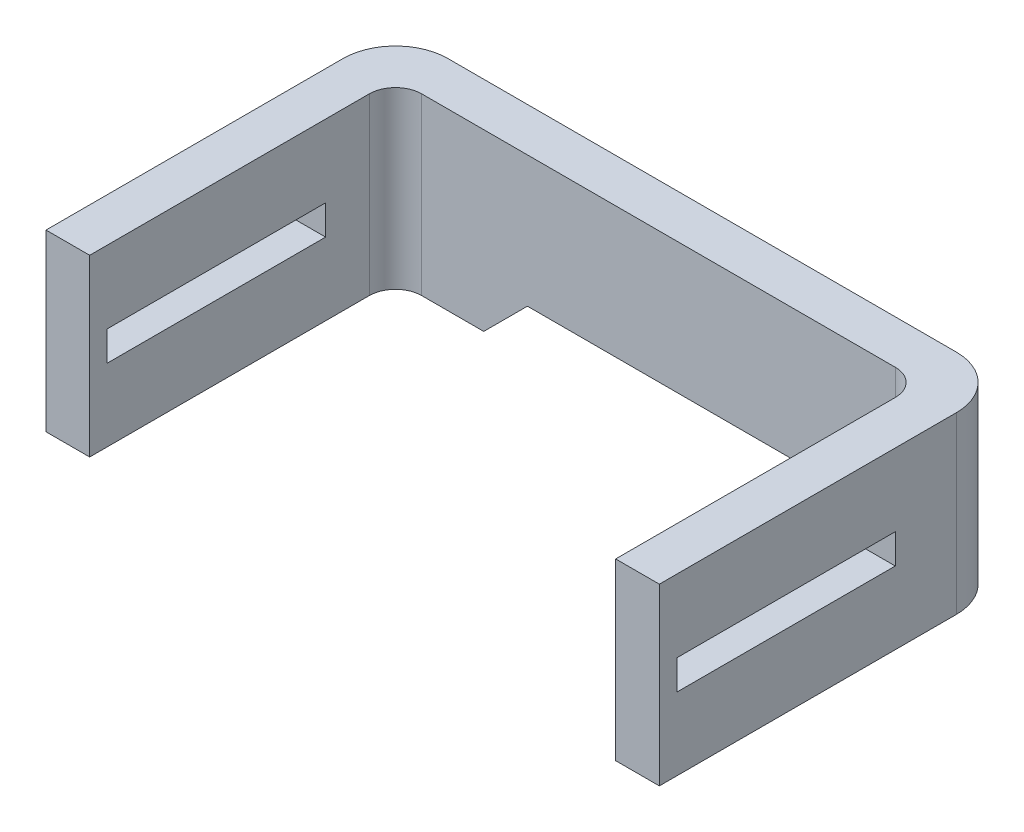
ISO-10303-21;
HEADER;
FILE_DESCRIPTION(('STEP AP214'),'2;1');
FILE_NAME('part.step','',(''),(''),'','','');
FILE_SCHEMA(('AUTOMOTIVE_DESIGN { 1 0 10303 214 1 1 1 1 }'));
ENDSEC;
DATA;
#1=APPLICATION_CONTEXT('core data for automotive mechanical design processes');
#2=APPLICATION_PROTOCOL_DEFINITION('international standard','automotive_design',2000,#1);
#3=PRODUCT_CONTEXT('',#1,'mechanical');
#4=PRODUCT('Part','Part','',(#3));
#5=PRODUCT_RELATED_PRODUCT_CATEGORY('part','',(#4));
#6=PRODUCT_DEFINITION_FORMATION('','',#4);
#7=PRODUCT_DEFINITION_CONTEXT('part definition',#1,'design');
#8=PRODUCT_DEFINITION('design','',#6,#7);
#9=PRODUCT_DEFINITION_SHAPE('','',#8);
#10=(LENGTH_UNIT() NAMED_UNIT(*) SI_UNIT(.MILLI.,.METRE.));
#11=(NAMED_UNIT(*) PLANE_ANGLE_UNIT() SI_UNIT($,.RADIAN.));
#12=(NAMED_UNIT(*) SI_UNIT($,.STERADIAN.) SOLID_ANGLE_UNIT());
#13=UNCERTAINTY_MEASURE_WITH_UNIT(LENGTH_MEASURE(1.E-05),#10,'distance_accuracy_value','');
#14=(GEOMETRIC_REPRESENTATION_CONTEXT(3) GLOBAL_UNCERTAINTY_ASSIGNED_CONTEXT((#13)) GLOBAL_UNIT_ASSIGNED_CONTEXT((#10,
#11,#12)) REPRESENTATION_CONTEXT('',''));
#15=CARTESIAN_POINT('',(0.,0.,0.));
#16=DIRECTION('',(0.,0.,1.));
#17=DIRECTION('',(1.,0.,0.));
#18=AXIS2_PLACEMENT_3D('',#15,#16,#17);
#19=CARTESIAN_POINT('',(0.,0.,0.));
#20=DIRECTION('',(0.,1.,0.));
#21=DIRECTION('',(0.,0.,1.));
#22=AXIS2_PLACEMENT_3D('',#19,#20,#21);
#23=PLANE('',#22);
#24=DIRECTION('',(1.,0.,0.));
#25=VECTOR('',#24,1.);
#26=CARTESIAN_POINT('',(0.,0.,-35.));
#27=LINE('',#26,#25);
#28=CARTESIAN_POINT('',(50.1,0.,-35.));
#29=VERTEX_POINT('',#28);
#30=CARTESIAN_POINT('',(57.2,0.,-35.));
#31=VERTEX_POINT('',#30);
#32=EDGE_CURVE('E217',#29,#31,#27,.T.);
#33=ORIENTED_EDGE('',*,*,#32,.F.);
#34=DIRECTION('',(0.,0.,-1.));
#35=VECTOR('',#34,1.);
#36=CARTESIAN_POINT('',(50.1,0.,0.));
#37=LINE('',#36,#35);
#38=CARTESIAN_POINT('',(50.1,0.,-40.));
#39=VERTEX_POINT('',#38);
#40=EDGE_CURVE('E11',#29,#39,#37,.T.);
#41=ORIENTED_EDGE('',*,*,#40,.T.);
#42=DIRECTION('',(-1.,0.,0.));
#43=VECTOR('',#42,1.);
#44=CARTESIAN_POINT('',(65.2,0.,-40.));
#45=LINE('',#44,#43);
#46=CARTESIAN_POINT('',(59.2,0.,-40.));
#47=VERTEX_POINT('',#46);
#48=EDGE_CURVE('E215',#47,#39,#45,.T.);
#49=ORIENTED_EDGE('',*,*,#48,.F.);
#50=CARTESIAN_POINT('',(59.2,0.,-34.));
#51=DIRECTION('',(0.,1.,0.));
#52=DIRECTION('',(0.,0.,1.));
#53=AXIS2_PLACEMENT_3D('',#50,#51,#52);
#54=CIRCLE('',#53,6.);
#55=CARTESIAN_POINT('',(65.2,0.,-34.));
#56=VERTEX_POINT('',#55);
#57=EDGE_CURVE('E269',#47,#56,#54,.F.);
#58=ORIENTED_EDGE('',*,*,#57,.T.);
#59=DIRECTION('',(0.,0.,-1.));
#60=VECTOR('',#59,1.);
#61=CARTESIAN_POINT('',(65.2,0.,0.));
#62=LINE('',#61,#60);
#63=CARTESIAN_POINT('',(65.2,0.,0.));
#64=VERTEX_POINT('',#63);
#65=EDGE_CURVE('E228',#64,#56,#62,.T.);
#66=ORIENTED_EDGE('',*,*,#65,.F.);
#67=DIRECTION('',(1.,0.,0.));
#68=VECTOR('',#67,1.);
#69=CARTESIAN_POINT('',(60.2,0.,0.));
#70=LINE('',#69,#68);
#71=CARTESIAN_POINT('',(60.2,0.,0.));
#72=VERTEX_POINT('',#71);
#73=EDGE_CURVE('E293',#72,#64,#70,.T.);
#74=ORIENTED_EDGE('',*,*,#73,.F.);
#75=DIRECTION('',(0.,0.,1.));
#76=VECTOR('',#75,1.);
#77=CARTESIAN_POINT('',(60.2,0.,-35.));
#78=LINE('',#77,#76);
#79=CARTESIAN_POINT('',(60.2,0.,-32.));
#80=VERTEX_POINT('',#79);
#81=EDGE_CURVE('E291',#80,#72,#78,.T.);
#82=ORIENTED_EDGE('',*,*,#81,.F.);
#83=CARTESIAN_POINT('',(57.2,0.,-32.));
#84=DIRECTION('',(0.,1.,0.));
#85=DIRECTION('',(0.,0.,1.));
#86=AXIS2_PLACEMENT_3D('',#83,#84,#85);
#87=CIRCLE('',#86,3.);
#88=EDGE_CURVE('E255',#80,#31,#87,.T.);
#89=ORIENTED_EDGE('',*,*,#88,.T.);
#90=EDGE_LOOP('',(#33,#41,#49,#58,#66,#74,#82,#89));
#91=FACE_BOUND('',#90,.T.);
#92=ADVANCED_FACE('F39',(#91),#23,.F.);
#93=CARTESIAN_POINT('',(-5.,20.,0.));
#94=DIRECTION('',(0.,0.,-1.));
#95=DIRECTION('',(-1.,0.,0.));
#96=AXIS2_PLACEMENT_3D('',#93,#94,#95);
#97=PLANE('',#96);
#98=DIRECTION('',(1.,0.,0.));
#99=VECTOR('',#98,1.);
#100=CARTESIAN_POINT('',(-5.,0.,0.));
#101=LINE('',#100,#99);
#102=CARTESIAN_POINT('',(-5.,0.,0.));
#103=VERTEX_POINT('',#102);
#104=CARTESIAN_POINT('',(0.,0.,0.));
#105=VERTEX_POINT('',#104);
#106=EDGE_CURVE('E320',#103,#105,#101,.T.);
#107=ORIENTED_EDGE('',*,*,#106,.T.);
#108=DIRECTION('',(0.,-1.,0.));
#109=VECTOR('',#108,1.);
#110=CARTESIAN_POINT('',(0.,20.,0.));
#111=LINE('',#110,#109);
#112=CARTESIAN_POINT('',(0.,20.,0.));
#113=VERTEX_POINT('',#112);
#114=EDGE_CURVE('E242',#113,#105,#111,.T.);
#115=ORIENTED_EDGE('',*,*,#114,.F.);
#116=DIRECTION('',(1.,0.,0.));
#117=VECTOR('',#116,1.);
#118=CARTESIAN_POINT('',(-5.,20.,0.));
#119=LINE('',#118,#117);
#120=CARTESIAN_POINT('',(-5.,20.,0.));
#121=VERTEX_POINT('',#120);
#122=EDGE_CURVE('E226',#121,#113,#119,.T.);
#123=ORIENTED_EDGE('',*,*,#122,.F.);
#124=DIRECTION('',(0.,-1.,0.));
#125=VECTOR('',#124,1.);
#126=CARTESIAN_POINT('',(-5.,20.,0.));
#127=LINE('',#126,#125);
#128=EDGE_CURVE('E232',#121,#103,#127,.T.);
#129=ORIENTED_EDGE('',*,*,#128,.T.);
#130=EDGE_LOOP('',(#107,#115,#123,#129));
#131=FACE_BOUND('',#130,.T.);
#132=ADVANCED_FACE('F363',(#131),#97,.F.);
#133=CARTESIAN_POINT('',(0.,20.,0.));
#134=DIRECTION('',(-1.,0.,0.));
#135=DIRECTION('',(0.,0.,1.));
#136=AXIS2_PLACEMENT_3D('',#133,#134,#135);
#137=PLANE('',#136);
#138=DIRECTION('',(0.,0.,-1.));
#139=VECTOR('',#138,1.);
#140=CARTESIAN_POINT('',(0.,11.7,0.));
#141=LINE('',#140,#139);
#142=CARTESIAN_POINT('',(0.,11.7,-2.));
#143=VERTEX_POINT('',#142);
#144=CARTESIAN_POINT('',(0.,11.7,-27.));
#145=VERTEX_POINT('',#144);
#146=EDGE_CURVE('E334',#143,#145,#141,.T.);
#147=ORIENTED_EDGE('',*,*,#146,.T.);
#148=DIRECTION('',(0.,-1.,0.));
#149=VECTOR('',#148,1.);
#150=CARTESIAN_POINT('',(0.,20.,-27.));
#151=LINE('',#150,#149);
#152=CARTESIAN_POINT('',(0.,8.3,-27.));
#153=VERTEX_POINT('',#152);
#154=EDGE_CURVE('E322',#145,#153,#151,.T.);
#155=ORIENTED_EDGE('',*,*,#154,.T.);
#156=DIRECTION('',(0.,0.,1.));
#157=VECTOR('',#156,1.);
#158=CARTESIAN_POINT('',(0.,8.3,0.));
#159=LINE('',#158,#157);
#160=CARTESIAN_POINT('',(0.,8.3,-2.));
#161=VERTEX_POINT('',#160);
#162=EDGE_CURVE('E467',#153,#161,#159,.T.);
#163=ORIENTED_EDGE('',*,*,#162,.T.);
#164=DIRECTION('',(0.,1.,0.));
#165=VECTOR('',#164,1.);
#166=CARTESIAN_POINT('',(0.,20.,-2.));
#167=LINE('',#166,#165);
#168=EDGE_CURVE('E472',#161,#143,#167,.T.);
#169=ORIENTED_EDGE('',*,*,#168,.T.);
#170=EDGE_LOOP('',(#147,#155,#163,#169));
#171=FACE_BOUND('',#170,.T.);
#172=DIRECTION('',(0.,0.,-1.));
#173=VECTOR('',#172,1.);
#174=CARTESIAN_POINT('',(0.,0.,0.));
#175=LINE('',#174,#173);
#176=CARTESIAN_POINT('',(0.,0.,-32.));
#177=VERTEX_POINT('',#176);
#178=EDGE_CURVE('E295',#105,#177,#175,.T.);
#179=ORIENTED_EDGE('',*,*,#178,.T.);
#180=DIRECTION('',(0.,-1.,0.));
#181=VECTOR('',#180,1.);
#182=CARTESIAN_POINT('',(0.,20.,-32.));
#183=LINE('',#182,#181);
#184=CARTESIAN_POINT('',(0.,20.,-32.));
#185=VERTEX_POINT('',#184);
#186=EDGE_CURVE('E253',#177,#185,#183,.F.);
#187=ORIENTED_EDGE('',*,*,#186,.T.);
#188=DIRECTION('',(0.,0.,-1.));
#189=VECTOR('',#188,1.);
#190=CARTESIAN_POINT('',(0.,20.,0.));
#191=LINE('',#190,#189);
#192=EDGE_CURVE('E340',#113,#185,#191,.T.);
#193=ORIENTED_EDGE('',*,*,#192,.F.);
#194=ORIENTED_EDGE('',*,*,#114,.T.);
#195=EDGE_LOOP('',(#179,#187,#193,#194));
#196=FACE_BOUND('',#195,.T.);
#197=ADVANCED_FACE('F368',(#171,#196),#137,.F.);
#198=CARTESIAN_POINT('',(0.,20.,-35.));
#199=DIRECTION('',(0.,0.,-1.));
#200=DIRECTION('',(-1.,0.,0.));
#201=AXIS2_PLACEMENT_3D('',#198,#199,#200);
#202=PLANE('',#201);
#203=DIRECTION('',(1.,0.,0.));
#204=VECTOR('',#203,1.);
#205=CARTESIAN_POINT('',(0.,5.,-35.));
#206=LINE('',#205,#204);
#207=CARTESIAN_POINT('',(15.1000000000001,5.,-35.));
#208=VERTEX_POINT('',#207);
#209=CARTESIAN_POINT('',(45.1,5.,-35.));
#210=VERTEX_POINT('',#209);
#211=EDGE_CURVE('E416',#208,#210,#206,.T.);
#212=ORIENTED_EDGE('',*,*,#211,.T.);
#213=DIRECTION('',(0.707106781186551,-0.707106781186544,0.));
#214=VECTOR('',#213,1.);
#215=CARTESIAN_POINT('',(15.0499999999997,35.0499999999999,-35.));
#216=LINE('',#215,#214);
#217=EDGE_CURVE('E423',#210,#29,#216,.T.);
#218=ORIENTED_EDGE('',*,*,#217,.T.);
#219=ORIENTED_EDGE('',*,*,#32,.T.);
#220=DIRECTION('',(0.,-1.,0.));
#221=VECTOR('',#220,1.);
#222=CARTESIAN_POINT('',(57.2,20.,-35.));
#223=LINE('',#222,#221);
#224=CARTESIAN_POINT('',(57.2,20.,-35.));
#225=VERTEX_POINT('',#224);
#226=EDGE_CURVE('E251',#31,#225,#223,.F.);
#227=ORIENTED_EDGE('',*,*,#226,.T.);
#228=DIRECTION('',(1.,0.,0.));
#229=VECTOR('',#228,1.);
#230=CARTESIAN_POINT('',(0.,20.,-35.));
#231=LINE('',#230,#229);
#232=CARTESIAN_POINT('',(3.,20.,-35.));
#233=VERTEX_POINT('',#232);
#234=EDGE_CURVE('E343',#233,#225,#231,.T.);
#235=ORIENTED_EDGE('',*,*,#234,.F.);
#236=DIRECTION('',(0.,-1.,0.));
#237=VECTOR('',#236,1.);
#238=CARTESIAN_POINT('',(3.,0.,-35.));
#239=LINE('',#238,#237);
#240=CARTESIAN_POINT('',(3.,0.,-35.));
#241=VERTEX_POINT('',#240);
#242=EDGE_CURVE('E248',#233,#241,#239,.T.);
#243=ORIENTED_EDGE('',*,*,#242,.T.);
#244=CARTESIAN_POINT('',(10.1,0.,-35.));
#245=VERTEX_POINT('',#244);
#246=EDGE_CURVE('E283',#241,#245,#27,.T.);
#247=ORIENTED_EDGE('',*,*,#246,.T.);
#248=DIRECTION('',(0.707106781186552,0.707106781186543,0.));
#249=VECTOR('',#248,1.);
#250=CARTESIAN_POINT('',(15.0499999999999,4.94999999999988,-35.));
#251=LINE('',#250,#249);
#252=EDGE_CURVE('E54',#245,#208,#251,.T.);
#253=ORIENTED_EDGE('',*,*,#252,.T.);
#254=EDGE_LOOP('',(#212,#218,#219,#227,#235,#243,#247,#253));
#255=FACE_BOUND('',#254,.T.);
#256=ADVANCED_FACE('F288',(#255),#202,.F.);
#257=CARTESIAN_POINT('',(60.2,20.,-35.));
#258=DIRECTION('',(1.,0.,0.));
#259=DIRECTION('',(0.,0.,-1.));
#260=AXIS2_PLACEMENT_3D('',#257,#258,#259);
#261=PLANE('',#260);
#262=DIRECTION('',(0.,0.,-1.));
#263=VECTOR('',#262,1.);
#264=CARTESIAN_POINT('',(60.2,8.3,-35.));
#265=LINE('',#264,#263);
#266=CARTESIAN_POINT('',(60.2,8.3,-2.00000000000001));
#267=VERTEX_POINT('',#266);
#268=CARTESIAN_POINT('',(60.2,8.3,-27.));
#269=VERTEX_POINT('',#268);
#270=EDGE_CURVE('E453',#267,#269,#265,.T.);
#271=ORIENTED_EDGE('',*,*,#270,.T.);
#272=DIRECTION('',(0.,1.,0.));
#273=VECTOR('',#272,1.);
#274=CARTESIAN_POINT('',(60.2,20.,-27.));
#275=LINE('',#274,#273);
#276=CARTESIAN_POINT('',(60.2,11.7,-27.));
#277=VERTEX_POINT('',#276);
#278=EDGE_CURVE('E328',#269,#277,#275,.T.);
#279=ORIENTED_EDGE('',*,*,#278,.T.);
#280=DIRECTION('',(0.,0.,1.));
#281=VECTOR('',#280,1.);
#282=CARTESIAN_POINT('',(60.2,11.7,-35.));
#283=LINE('',#282,#281);
#284=CARTESIAN_POINT('',(60.2,11.7,-2.00000000000001));
#285=VERTEX_POINT('',#284);
#286=EDGE_CURVE('E475',#277,#285,#283,.T.);
#287=ORIENTED_EDGE('',*,*,#286,.T.);
#288=DIRECTION('',(0.,-1.,0.));
#289=VECTOR('',#288,1.);
#290=CARTESIAN_POINT('',(60.2,20.,-2.00000000000001));
#291=LINE('',#290,#289);
#292=EDGE_CURVE('E469',#285,#267,#291,.T.);
#293=ORIENTED_EDGE('',*,*,#292,.T.);
#294=EDGE_LOOP('',(#271,#279,#287,#293));
#295=FACE_BOUND('',#294,.T.);
#296=DIRECTION('',(0.,0.,1.));
#297=VECTOR('',#296,1.);
#298=CARTESIAN_POINT('',(60.2,20.,-35.));
#299=LINE('',#298,#297);
#300=CARTESIAN_POINT('',(60.2,20.,-32.));
#301=VERTEX_POINT('',#300);
#302=CARTESIAN_POINT('',(60.2,20.,0.));
#303=VERTEX_POINT('',#302);
#304=EDGE_CURVE('E346',#301,#303,#299,.T.);
#305=ORIENTED_EDGE('',*,*,#304,.F.);
#306=DIRECTION('',(0.,-1.,0.));
#307=VECTOR('',#306,1.);
#308=CARTESIAN_POINT('',(60.2,0.,-32.));
#309=LINE('',#308,#307);
#310=EDGE_CURVE('E245',#301,#80,#309,.T.);
#311=ORIENTED_EDGE('',*,*,#310,.T.);
#312=ORIENTED_EDGE('',*,*,#81,.T.);
#313=DIRECTION('',(0.,-1.,0.));
#314=VECTOR('',#313,1.);
#315=CARTESIAN_POINT('',(60.2,20.,0.));
#316=LINE('',#315,#314);
#317=EDGE_CURVE('E239',#303,#72,#316,.T.);
#318=ORIENTED_EDGE('',*,*,#317,.F.);
#319=EDGE_LOOP('',(#305,#311,#312,#318));
#320=FACE_BOUND('',#319,.T.);
#321=ADVANCED_FACE('F352',(#295,#320),#261,.F.);
#322=CARTESIAN_POINT('',(60.2,20.,0.));
#323=DIRECTION('',(0.,0.,-1.));
#324=DIRECTION('',(-1.,0.,0.));
#325=AXIS2_PLACEMENT_3D('',#322,#323,#324);
#326=PLANE('',#325);
#327=ORIENTED_EDGE('',*,*,#73,.T.);
#328=DIRECTION('',(0.,-1.,0.));
#329=VECTOR('',#328,1.);
#330=CARTESIAN_POINT('',(65.2,20.,0.));
#331=LINE('',#330,#329);
#332=CARTESIAN_POINT('',(65.2,20.,0.));
#333=VERTEX_POINT('',#332);
#334=EDGE_CURVE('E235',#333,#64,#331,.T.);
#335=ORIENTED_EDGE('',*,*,#334,.F.);
#336=DIRECTION('',(1.,0.,0.));
#337=VECTOR('',#336,1.);
#338=CARTESIAN_POINT('',(60.2,20.,0.));
#339=LINE('',#338,#337);
#340=EDGE_CURVE('E317',#303,#333,#339,.T.);
#341=ORIENTED_EDGE('',*,*,#340,.F.);
#342=ORIENTED_EDGE('',*,*,#317,.T.);
#343=EDGE_LOOP('',(#327,#335,#341,#342));
#344=FACE_BOUND('',#343,.T.);
#345=ADVANCED_FACE('F350',(#344),#326,.F.);
#346=CARTESIAN_POINT('',(65.2,20.,0.));
#347=DIRECTION('',(-1.,0.,0.));
#348=DIRECTION('',(0.,0.,1.));
#349=AXIS2_PLACEMENT_3D('',#346,#347,#348);
#350=PLANE('',#349);
#351=DIRECTION('',(0.,0.,-1.));
#352=VECTOR('',#351,1.);
#353=CARTESIAN_POINT('',(65.2,11.7,-27.));
#354=LINE('',#353,#352);
#355=CARTESIAN_POINT('',(65.2,11.7,-2.00000000000001));
#356=VERTEX_POINT('',#355);
#357=CARTESIAN_POINT('',(65.2,11.7,-27.));
#358=VERTEX_POINT('',#357);
#359=EDGE_CURVE('E437',#356,#358,#354,.T.);
#360=ORIENTED_EDGE('',*,*,#359,.T.);
#361=DIRECTION('',(0.,-1.,0.));
#362=VECTOR('',#361,1.);
#363=CARTESIAN_POINT('',(65.2,11.7,-27.));
#364=LINE('',#363,#362);
#365=CARTESIAN_POINT('',(65.2,8.3,-27.));
#366=VERTEX_POINT('',#365);
#367=EDGE_CURVE('E427',#358,#366,#364,.T.);
#368=ORIENTED_EDGE('',*,*,#367,.T.);
#369=DIRECTION('',(0.,0.,1.));
#370=VECTOR('',#369,1.);
#371=CARTESIAN_POINT('',(65.2,8.3,-27.));
#372=LINE('',#371,#370);
#373=CARTESIAN_POINT('',(65.2,8.3,-2.));
#374=VERTEX_POINT('',#373);
#375=EDGE_CURVE('E430',#366,#374,#372,.T.);
#376=ORIENTED_EDGE('',*,*,#375,.T.);
#377=DIRECTION('',(0.,1.,0.));
#378=VECTOR('',#377,1.);
#379=CARTESIAN_POINT('',(65.2,11.7,-2.00000000000001));
#380=LINE('',#379,#378);
#381=EDGE_CURVE('E434',#374,#356,#380,.T.);
#382=ORIENTED_EDGE('',*,*,#381,.T.);
#383=EDGE_LOOP('',(#360,#368,#376,#382));
#384=FACE_BOUND('',#383,.T.);
#385=ORIENTED_EDGE('',*,*,#65,.T.);
#386=DIRECTION('',(0.,-1.,0.));
#387=VECTOR('',#386,1.);
#388=CARTESIAN_POINT('',(65.2,20.,-34.));
#389=LINE('',#388,#387);
#390=CARTESIAN_POINT('',(65.2,20.,-34.));
#391=VERTEX_POINT('',#390);
#392=EDGE_CURVE('E271',#56,#391,#389,.F.);
#393=ORIENTED_EDGE('',*,*,#392,.T.);
#394=DIRECTION('',(0.,0.,-1.));
#395=VECTOR('',#394,1.);
#396=CARTESIAN_POINT('',(65.2,20.,0.));
#397=LINE('',#396,#395);
#398=EDGE_CURVE('E313',#333,#391,#397,.T.);
#399=ORIENTED_EDGE('',*,*,#398,.F.);
#400=ORIENTED_EDGE('',*,*,#334,.T.);
#401=EDGE_LOOP('',(#385,#393,#399,#400));
#402=FACE_BOUND('',#401,.T.);
#403=ADVANCED_FACE('F305',(#384,#402),#350,.F.);
#404=CARTESIAN_POINT('',(65.2,20.,-40.));
#405=DIRECTION('',(0.,0.,1.));
#406=DIRECTION('',(1.,0.,0.));
#407=AXIS2_PLACEMENT_3D('',#404,#405,#406);
#408=PLANE('',#407);
#409=ORIENTED_EDGE('',*,*,#48,.T.);
#410=DIRECTION('',(0.707106781186551,-0.707106781186544,0.));
#411=VECTOR('',#410,1.);
#412=CARTESIAN_POINT('',(45.0999999999999,5.,-40.));
#413=LINE('',#412,#411);
#414=CARTESIAN_POINT('',(45.0999999999999,5.,-40.));
#415=VERTEX_POINT('',#414);
#416=EDGE_CURVE('E201',#415,#39,#413,.T.);
#417=ORIENTED_EDGE('',*,*,#416,.F.);
#418=DIRECTION('',(1.,0.,0.));
#419=VECTOR('',#418,1.);
#420=CARTESIAN_POINT('',(45.0999999999999,5.,-40.));
#421=LINE('',#420,#419);
#422=CARTESIAN_POINT('',(15.1000000000001,5.,-40.));
#423=VERTEX_POINT('',#422);
#424=EDGE_CURVE('E415',#423,#415,#421,.T.);
#425=ORIENTED_EDGE('',*,*,#424,.F.);
#426=DIRECTION('',(0.707106781186552,0.707106781186543,0.));
#427=VECTOR('',#426,1.);
#428=CARTESIAN_POINT('',(10.1,0.,-40.));
#429=LINE('',#428,#427);
#430=CARTESIAN_POINT('',(10.1,0.,-40.));
#431=VERTEX_POINT('',#430);
#432=EDGE_CURVE('E210',#431,#423,#429,.T.);
#433=ORIENTED_EDGE('',*,*,#432,.F.);
#434=CARTESIAN_POINT('',(1.,0.,-40.));
#435=VERTEX_POINT('',#434);
#436=EDGE_CURVE('E224',#431,#435,#45,.T.);
#437=ORIENTED_EDGE('',*,*,#436,.T.);
#438=DIRECTION('',(0.,-1.,0.));
#439=VECTOR('',#438,1.);
#440=CARTESIAN_POINT('',(1.,20.,-40.));
#441=LINE('',#440,#439);
#442=CARTESIAN_POINT('',(1.,20.,-40.));
#443=VERTEX_POINT('',#442);
#444=EDGE_CURVE('E263',#435,#443,#441,.F.);
#445=ORIENTED_EDGE('',*,*,#444,.T.);
#446=DIRECTION('',(-1.,0.,0.));
#447=VECTOR('',#446,1.);
#448=CARTESIAN_POINT('',(65.2,20.,-40.));
#449=LINE('',#448,#447);
#450=CARTESIAN_POINT('',(59.2,20.,-40.));
#451=VERTEX_POINT('',#450);
#452=EDGE_CURVE('E312',#451,#443,#449,.T.);
#453=ORIENTED_EDGE('',*,*,#452,.F.);
#454=DIRECTION('',(0.,-1.,0.));
#455=VECTOR('',#454,1.);
#456=CARTESIAN_POINT('',(59.2,20.,-40.));
#457=LINE('',#456,#455);
#458=EDGE_CURVE('E222',#451,#47,#457,.T.);
#459=ORIENTED_EDGE('',*,*,#458,.T.);
#460=EDGE_LOOP('',(#409,#417,#425,#433,#437,#445,#453,#459));
#461=FACE_BOUND('',#460,.T.);
#462=ADVANCED_FACE('F219',(#461),#408,.F.);
#463=CARTESIAN_POINT('',(-5.00000000000001,20.,-40.));
#464=DIRECTION('',(1.,0.,0.));
#465=DIRECTION('',(0.,0.,-1.));
#466=AXIS2_PLACEMENT_3D('',#463,#464,#465);
#467=PLANE('',#466);
#468=DIRECTION('',(0.,0.,1.));
#469=VECTOR('',#468,1.);
#470=CARTESIAN_POINT('',(-5.,8.3,-27.));
#471=LINE('',#470,#469);
#472=CARTESIAN_POINT('',(-5.,8.3,-27.));
#473=VERTEX_POINT('',#472);
#474=CARTESIAN_POINT('',(-5.,8.3,-2.));
#475=VERTEX_POINT('',#474);
#476=EDGE_CURVE('E442',#473,#475,#471,.T.);
#477=ORIENTED_EDGE('',*,*,#476,.F.);
#478=DIRECTION('',(0.,-1.,0.));
#479=VECTOR('',#478,1.);
#480=CARTESIAN_POINT('',(-5.,11.7,-27.));
#481=LINE('',#480,#479);
#482=CARTESIAN_POINT('',(-5.,11.7,-27.));
#483=VERTEX_POINT('',#482);
#484=EDGE_CURVE('E426',#483,#473,#481,.T.);
#485=ORIENTED_EDGE('',*,*,#484,.F.);
#486=DIRECTION('',(0.,0.,-1.));
#487=VECTOR('',#486,1.);
#488=CARTESIAN_POINT('',(-5.,11.7,-27.));
#489=LINE('',#488,#487);
#490=CARTESIAN_POINT('',(-5.,11.7,-2.));
#491=VERTEX_POINT('',#490);
#492=EDGE_CURVE('E431',#491,#483,#489,.T.);
#493=ORIENTED_EDGE('',*,*,#492,.F.);
#494=DIRECTION('',(0.,1.,0.));
#495=VECTOR('',#494,1.);
#496=CARTESIAN_POINT('',(-5.,11.7,-2.));
#497=LINE('',#496,#495);
#498=EDGE_CURVE('E445',#475,#491,#497,.T.);
#499=ORIENTED_EDGE('',*,*,#498,.F.);
#500=EDGE_LOOP('',(#477,#485,#493,#499));
#501=FACE_BOUND('',#500,.T.);
#502=DIRECTION('',(0.,0.,1.));
#503=VECTOR('',#502,1.);
#504=CARTESIAN_POINT('',(-5.00000000000001,20.,-40.));
#505=LINE('',#504,#503);
#506=CARTESIAN_POINT('',(-5.00000000000001,20.,-34.));
#507=VERTEX_POINT('',#506);
#508=EDGE_CURVE('E236',#507,#121,#505,.T.);
#509=ORIENTED_EDGE('',*,*,#508,.F.);
#510=DIRECTION('',(0.,-1.,0.));
#511=VECTOR('',#510,1.);
#512=CARTESIAN_POINT('',(-5.00000000000001,20.,-34.));
#513=LINE('',#512,#511);
#514=CARTESIAN_POINT('',(-5.00000000000001,0.,-34.));
#515=VERTEX_POINT('',#514);
#516=EDGE_CURVE('E276',#507,#515,#513,.T.);
#517=ORIENTED_EDGE('',*,*,#516,.T.);
#518=DIRECTION('',(0.,0.,1.));
#519=VECTOR('',#518,1.);
#520=CARTESIAN_POINT('',(-5.00000000000001,0.,-40.));
#521=LINE('',#520,#519);
#522=EDGE_CURVE('E223',#515,#103,#521,.T.);
#523=ORIENTED_EDGE('',*,*,#522,.T.);
#524=ORIENTED_EDGE('',*,*,#128,.F.);
#525=EDGE_LOOP('',(#509,#517,#523,#524));
#526=FACE_BOUND('',#525,.T.);
#527=ADVANCED_FACE('F382',(#501,#526),#467,.F.);
#528=CARTESIAN_POINT('',(0.,20.,0.));
#529=DIRECTION('',(0.,1.,0.));
#530=DIRECTION('',(0.,0.,1.));
#531=AXIS2_PLACEMENT_3D('',#528,#529,#530);
#532=PLANE('',#531);
#533=ORIENTED_EDGE('',*,*,#398,.T.);
#534=CARTESIAN_POINT('',(59.2,20.,-34.));
#535=DIRECTION('',(0.,1.,0.));
#536=DIRECTION('',(0.,0.,1.));
#537=AXIS2_PLACEMENT_3D('',#534,#535,#536);
#538=CIRCLE('',#537,6.);
#539=EDGE_CURVE('E274',#391,#451,#538,.T.);
#540=ORIENTED_EDGE('',*,*,#539,.T.);
#541=ORIENTED_EDGE('',*,*,#452,.T.);
#542=CARTESIAN_POINT('',(0.999999999999995,20.,-34.));
#543=DIRECTION('',(0.,1.,0.));
#544=DIRECTION('',(0.,0.,1.));
#545=AXIS2_PLACEMENT_3D('',#542,#543,#544);
#546=CIRCLE('',#545,6.);
#547=EDGE_CURVE('E62',#443,#507,#546,.T.);
#548=ORIENTED_EDGE('',*,*,#547,.T.);
#549=ORIENTED_EDGE('',*,*,#508,.T.);
#550=ORIENTED_EDGE('',*,*,#122,.T.);
#551=ORIENTED_EDGE('',*,*,#192,.T.);
#552=CARTESIAN_POINT('',(3.,20.,-32.));
#553=DIRECTION('',(0.,1.,0.));
#554=DIRECTION('',(0.,0.,1.));
#555=AXIS2_PLACEMENT_3D('',#552,#553,#554);
#556=CIRCLE('',#555,3.);
#557=EDGE_CURVE('E261',#185,#233,#556,.F.);
#558=ORIENTED_EDGE('',*,*,#557,.T.);
#559=ORIENTED_EDGE('',*,*,#234,.T.);
#560=CARTESIAN_POINT('',(57.2,20.,-32.));
#561=DIRECTION('',(0.,1.,0.));
#562=DIRECTION('',(0.,0.,1.));
#563=AXIS2_PLACEMENT_3D('',#560,#561,#562);
#564=CIRCLE('',#563,3.);
#565=EDGE_CURVE('E257',#225,#301,#564,.F.);
#566=ORIENTED_EDGE('',*,*,#565,.T.);
#567=ORIENTED_EDGE('',*,*,#304,.T.);
#568=ORIENTED_EDGE('',*,*,#340,.T.);
#569=EDGE_LOOP('',(#533,#540,#541,#548,#549,#550,#551,#558,#559,#566,#567,#568));
#570=FACE_BOUND('',#569,.T.);
#571=ADVANCED_FACE('F311',(#570),#532,.T.);
#572=ORIENTED_EDGE('',*,*,#436,.F.);
#573=DIRECTION('',(0.,0.,1.));
#574=VECTOR('',#573,1.);
#575=CARTESIAN_POINT('',(10.1,0.,0.));
#576=LINE('',#575,#574);
#577=EDGE_CURVE('E47',#431,#245,#576,.T.);
#578=ORIENTED_EDGE('',*,*,#577,.T.);
#579=ORIENTED_EDGE('',*,*,#246,.F.);
#580=CARTESIAN_POINT('',(3.,0.,-32.));
#581=DIRECTION('',(0.,1.,0.));
#582=DIRECTION('',(0.,0.,1.));
#583=AXIS2_PLACEMENT_3D('',#580,#581,#582);
#584=CIRCLE('',#583,3.);
#585=EDGE_CURVE('E259',#241,#177,#584,.T.);
#586=ORIENTED_EDGE('',*,*,#585,.T.);
#587=ORIENTED_EDGE('',*,*,#178,.F.);
#588=ORIENTED_EDGE('',*,*,#106,.F.);
#589=ORIENTED_EDGE('',*,*,#522,.F.);
#590=CARTESIAN_POINT('',(0.999999999999995,0.,-34.));
#591=DIRECTION('',(0.,1.,0.));
#592=DIRECTION('',(0.,0.,1.));
#593=AXIS2_PLACEMENT_3D('',#590,#591,#592);
#594=CIRCLE('',#593,6.);
#595=EDGE_CURVE('E266',#515,#435,#594,.F.);
#596=ORIENTED_EDGE('',*,*,#595,.T.);
#597=EDGE_LOOP('',(#572,#578,#579,#586,#587,#588,#589,#596));
#598=FACE_BOUND('',#597,.T.);
#599=ADVANCED_FACE('F282',(#598),#23,.F.);
#600=CARTESIAN_POINT('',(65.2,8.3,-27.));
#601=DIRECTION('',(0.,-1.,0.));
#602=DIRECTION('',(0.,0.,-1.));
#603=AXIS2_PLACEMENT_3D('',#600,#601,#602);
#604=PLANE('',#603);
#605=DIRECTION('',(-1.,0.,0.));
#606=VECTOR('',#605,1.);
#607=CARTESIAN_POINT('',(65.2,8.3,-27.));
#608=LINE('',#607,#606);
#609=EDGE_CURVE('E440',#153,#473,#608,.T.);
#610=ORIENTED_EDGE('',*,*,#609,.T.);
#611=ORIENTED_EDGE('',*,*,#476,.T.);
#612=DIRECTION('',(-1.,0.,0.));
#613=VECTOR('',#612,1.);
#614=CARTESIAN_POINT('',(65.2,8.3,-2.00000000000001));
#615=LINE('',#614,#613);
#616=EDGE_CURVE('E462',#161,#475,#615,.T.);
#617=ORIENTED_EDGE('',*,*,#616,.F.);
#618=ORIENTED_EDGE('',*,*,#162,.F.);
#619=EDGE_LOOP('',(#610,#611,#617,#618));
#620=FACE_BOUND('',#619,.T.);
#621=ADVANCED_FACE('F373',(#620),#604,.F.);
#622=CARTESIAN_POINT('',(65.2,11.7,-2.00000000000001));
#623=DIRECTION('',(0.,0.,1.));
#624=DIRECTION('',(1.,0.,0.));
#625=AXIS2_PLACEMENT_3D('',#622,#623,#624);
#626=PLANE('',#625);
#627=ORIENTED_EDGE('',*,*,#616,.T.);
#628=ORIENTED_EDGE('',*,*,#498,.T.);
#629=DIRECTION('',(-1.,0.,0.));
#630=VECTOR('',#629,1.);
#631=CARTESIAN_POINT('',(65.2,11.7,-2.00000000000001));
#632=LINE('',#631,#630);
#633=EDGE_CURVE('E458',#143,#491,#632,.T.);
#634=ORIENTED_EDGE('',*,*,#633,.F.);
#635=ORIENTED_EDGE('',*,*,#168,.F.);
#636=EDGE_LOOP('',(#627,#628,#634,#635));
#637=FACE_BOUND('',#636,.T.);
#638=ADVANCED_FACE('F378',(#637),#626,.F.);
#639=CARTESIAN_POINT('',(65.2,11.7,-27.));
#640=DIRECTION('',(0.,1.,0.));
#641=DIRECTION('',(0.,0.,1.));
#642=AXIS2_PLACEMENT_3D('',#639,#640,#641);
#643=PLANE('',#642);
#644=ORIENTED_EDGE('',*,*,#633,.T.);
#645=ORIENTED_EDGE('',*,*,#492,.T.);
#646=DIRECTION('',(-1.,0.,0.));
#647=VECTOR('',#646,1.);
#648=CARTESIAN_POINT('',(65.2,11.7,-27.));
#649=LINE('',#648,#647);
#650=EDGE_CURVE('E454',#145,#483,#649,.T.);
#651=ORIENTED_EDGE('',*,*,#650,.F.);
#652=ORIENTED_EDGE('',*,*,#146,.F.);
#653=EDGE_LOOP('',(#644,#645,#651,#652));
#654=FACE_BOUND('',#653,.T.);
#655=ADVANCED_FACE('F391',(#654),#643,.F.);
#656=CARTESIAN_POINT('',(65.2,11.7,-27.));
#657=DIRECTION('',(0.,0.,-1.));
#658=DIRECTION('',(-1.,0.,0.));
#659=AXIS2_PLACEMENT_3D('',#656,#657,#658);
#660=PLANE('',#659);
#661=ORIENTED_EDGE('',*,*,#650,.T.);
#662=ORIENTED_EDGE('',*,*,#484,.T.);
#663=ORIENTED_EDGE('',*,*,#609,.F.);
#664=ORIENTED_EDGE('',*,*,#154,.F.);
#665=EDGE_LOOP('',(#661,#662,#663,#664));
#666=FACE_BOUND('',#665,.T.);
#667=ADVANCED_FACE('F388',(#666),#660,.F.);
#668=EDGE_CURVE('E463',#366,#269,#608,.T.);
#669=ORIENTED_EDGE('',*,*,#668,.F.);
#670=ORIENTED_EDGE('',*,*,#367,.F.);
#671=EDGE_CURVE('E450',#358,#277,#649,.T.);
#672=ORIENTED_EDGE('',*,*,#671,.T.);
#673=ORIENTED_EDGE('',*,*,#278,.F.);
#674=EDGE_LOOP('',(#669,#670,#672,#673));
#675=FACE_BOUND('',#674,.T.);
#676=ADVANCED_FACE('F390',(#675),#660,.F.);
#677=ORIENTED_EDGE('',*,*,#671,.F.);
#678=ORIENTED_EDGE('',*,*,#359,.F.);
#679=EDGE_CURVE('E455',#356,#285,#632,.T.);
#680=ORIENTED_EDGE('',*,*,#679,.T.);
#681=ORIENTED_EDGE('',*,*,#286,.F.);
#682=EDGE_LOOP('',(#677,#678,#680,#681));
#683=FACE_BOUND('',#682,.T.);
#684=ADVANCED_FACE('F401',(#683),#643,.F.);
#685=ORIENTED_EDGE('',*,*,#679,.F.);
#686=ORIENTED_EDGE('',*,*,#381,.F.);
#687=EDGE_CURVE('E459',#374,#267,#615,.T.);
#688=ORIENTED_EDGE('',*,*,#687,.T.);
#689=ORIENTED_EDGE('',*,*,#292,.F.);
#690=EDGE_LOOP('',(#685,#686,#688,#689));
#691=FACE_BOUND('',#690,.T.);
#692=ADVANCED_FACE('F397',(#691),#626,.F.);
#693=ORIENTED_EDGE('',*,*,#687,.F.);
#694=ORIENTED_EDGE('',*,*,#375,.F.);
#695=ORIENTED_EDGE('',*,*,#668,.T.);
#696=ORIENTED_EDGE('',*,*,#270,.F.);
#697=EDGE_LOOP('',(#693,#694,#695,#696));
#698=FACE_BOUND('',#697,.T.);
#699=ADVANCED_FACE('F381',(#698),#604,.F.);
#700=CARTESIAN_POINT('',(57.2,20.,-32.));
#701=DIRECTION('',(0.,1.,0.));
#702=DIRECTION('',(0.,0.,1.));
#703=AXIS2_PLACEMENT_3D('',#700,#701,#702);
#704=CYLINDRICAL_SURFACE('',#703,3.);
#705=ORIENTED_EDGE('',*,*,#565,.F.);
#706=ORIENTED_EDGE('',*,*,#226,.F.);
#707=ORIENTED_EDGE('',*,*,#88,.F.);
#708=ORIENTED_EDGE('',*,*,#310,.F.);
#709=EDGE_LOOP('',(#705,#706,#707,#708));
#710=FACE_BOUND('',#709,.T.);
#711=ADVANCED_FACE('F503',(#710),#704,.F.);
#712=CARTESIAN_POINT('',(3.,20.,-32.));
#713=DIRECTION('',(0.,1.,0.));
#714=DIRECTION('',(0.,0.,1.));
#715=AXIS2_PLACEMENT_3D('',#712,#713,#714);
#716=CYLINDRICAL_SURFACE('',#715,3.);
#717=ORIENTED_EDGE('',*,*,#557,.F.);
#718=ORIENTED_EDGE('',*,*,#186,.F.);
#719=ORIENTED_EDGE('',*,*,#585,.F.);
#720=ORIENTED_EDGE('',*,*,#242,.F.);
#721=EDGE_LOOP('',(#717,#718,#719,#720));
#722=FACE_BOUND('',#721,.T.);
#723=ADVANCED_FACE('F495',(#722),#716,.F.);
#724=CARTESIAN_POINT('',(59.2,20.,-34.));
#725=DIRECTION('',(0.,-1.,0.));
#726=DIRECTION('',(0.,0.,-1.));
#727=AXIS2_PLACEMENT_3D('',#724,#725,#726);
#728=CYLINDRICAL_SURFACE('',#727,6.);
#729=ORIENTED_EDGE('',*,*,#539,.F.);
#730=ORIENTED_EDGE('',*,*,#392,.F.);
#731=ORIENTED_EDGE('',*,*,#57,.F.);
#732=ORIENTED_EDGE('',*,*,#458,.F.);
#733=EDGE_LOOP('',(#729,#730,#731,#732));
#734=FACE_BOUND('',#733,.T.);
#735=ADVANCED_FACE('F310',(#734),#728,.T.);
#736=CARTESIAN_POINT('',(0.999999999999995,20.,-34.));
#737=DIRECTION('',(0.,-1.,0.));
#738=DIRECTION('',(0.,0.,-1.));
#739=AXIS2_PLACEMENT_3D('',#736,#737,#738);
#740=CYLINDRICAL_SURFACE('',#739,6.);
#741=ORIENTED_EDGE('',*,*,#547,.F.);
#742=ORIENTED_EDGE('',*,*,#444,.F.);
#743=ORIENTED_EDGE('',*,*,#595,.F.);
#744=ORIENTED_EDGE('',*,*,#516,.F.);
#745=EDGE_LOOP('',(#741,#742,#743,#744));
#746=FACE_BOUND('',#745,.T.);
#747=ADVANCED_FACE('F41',(#746),#740,.T.);
#748=CARTESIAN_POINT('',(45.1,5.,0.));
#749=DIRECTION('',(0.,1.,0.));
#750=DIRECTION('',(-1.,0.,0.));
#751=AXIS2_PLACEMENT_3D('',#748,#749,#750);
#752=PLANE('',#751);
#753=DIRECTION('',(0.,0.,-1.));
#754=VECTOR('',#753,1.);
#755=CARTESIAN_POINT('',(15.1000000000001,5.,0.));
#756=LINE('',#755,#754);
#757=EDGE_CURVE('E414',#208,#423,#756,.T.);
#758=ORIENTED_EDGE('',*,*,#757,.T.);
#759=ORIENTED_EDGE('',*,*,#424,.T.);
#760=DIRECTION('',(0.,0.,-1.));
#761=VECTOR('',#760,1.);
#762=CARTESIAN_POINT('',(45.1,5.,0.));
#763=LINE('',#762,#761);
#764=EDGE_CURVE('E205',#210,#415,#763,.T.);
#765=ORIENTED_EDGE('',*,*,#764,.F.);
#766=ORIENTED_EDGE('',*,*,#211,.F.);
#767=EDGE_LOOP('',(#758,#759,#765,#766));
#768=FACE_BOUND('',#767,.T.);
#769=ADVANCED_FACE('F405',(#768),#752,.F.);
#770=CARTESIAN_POINT('',(45.1,5.,0.));
#771=DIRECTION('',(0.707106781186544,0.707106781186551,0.));
#772=DIRECTION('',(-0.707106781186551,0.707106781186544,0.));
#773=AXIS2_PLACEMENT_3D('',#770,#771,#772);
#774=PLANE('',#773);
#775=ORIENTED_EDGE('',*,*,#764,.T.);
#776=ORIENTED_EDGE('',*,*,#416,.T.);
#777=ORIENTED_EDGE('',*,*,#40,.F.);
#778=ORIENTED_EDGE('',*,*,#217,.F.);
#779=EDGE_LOOP('',(#775,#776,#777,#778));
#780=FACE_BOUND('',#779,.T.);
#781=ADVANCED_FACE('F202',(#780),#774,.F.);
#782=CARTESIAN_POINT('',(10.1,0.,0.));
#783=DIRECTION('',(-0.707106781186543,0.707106781186552,0.));
#784=DIRECTION('',(-0.707106781186552,-0.707106781186543,0.));
#785=AXIS2_PLACEMENT_3D('',#782,#783,#784);
#786=PLANE('',#785);
#787=ORIENTED_EDGE('',*,*,#577,.F.);
#788=ORIENTED_EDGE('',*,*,#432,.T.);
#789=ORIENTED_EDGE('',*,*,#757,.F.);
#790=ORIENTED_EDGE('',*,*,#252,.F.);
#791=EDGE_LOOP('',(#787,#788,#789,#790));
#792=FACE_BOUND('',#791,.T.);
#793=ADVANCED_FACE('F404',(#792),#786,.F.);
#794=CLOSED_SHELL('',(#92,#132,#197,#256,#321,#345,#403,#462,#527,#571,#599,#621,#638,#655,#667,
#676,#684,#692,#699,#711,#723,#735,#747,#769,#781,#793));
#795=MANIFOLD_SOLID_BREP('B2',#794);
#796=ADVANCED_BREP_SHAPE_REPRESENTATION('',(#18,#795),#14);
#797=SHAPE_DEFINITION_REPRESENTATION(#9,#796);
ENDSEC;
END-ISO-10303-21;
